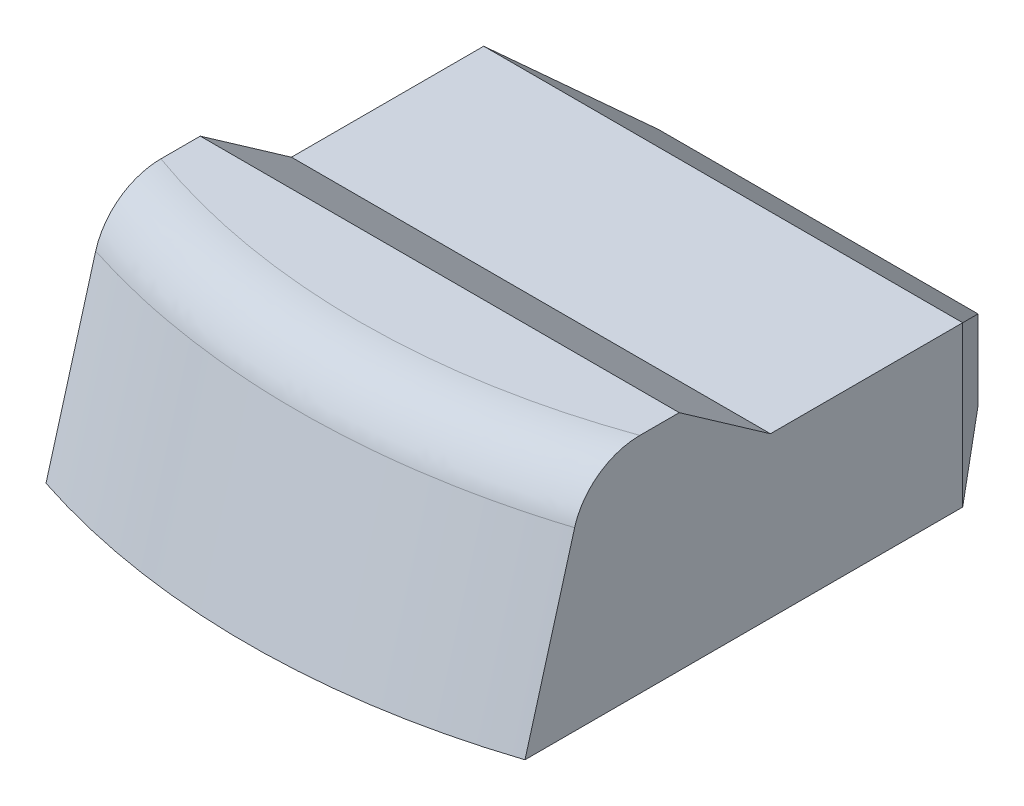
ISO-10303-21;
HEADER;
FILE_DESCRIPTION(('STEP AP214'),'2;1');
FILE_NAME('part.step','',(''),(''),'','','');
FILE_SCHEMA(('AUTOMOTIVE_DESIGN { 1 0 10303 214 1 1 1 1 }'));
ENDSEC;
DATA;
#1=APPLICATION_CONTEXT('core data for automotive mechanical design processes');
#2=APPLICATION_PROTOCOL_DEFINITION('international standard','automotive_design',2000,#1);
#3=PRODUCT_CONTEXT('',#1,'mechanical');
#4=PRODUCT('Part','Part','',(#3));
#5=PRODUCT_RELATED_PRODUCT_CATEGORY('part','',(#4));
#6=PRODUCT_DEFINITION_FORMATION('','',#4);
#7=PRODUCT_DEFINITION_CONTEXT('part definition',#1,'design');
#8=PRODUCT_DEFINITION('design','',#6,#7);
#9=PRODUCT_DEFINITION_SHAPE('','',#8);
#10=(LENGTH_UNIT() NAMED_UNIT(*) SI_UNIT(.MILLI.,.METRE.));
#11=(NAMED_UNIT(*) PLANE_ANGLE_UNIT() SI_UNIT($,.RADIAN.));
#12=(NAMED_UNIT(*) SI_UNIT($,.STERADIAN.) SOLID_ANGLE_UNIT());
#13=UNCERTAINTY_MEASURE_WITH_UNIT(LENGTH_MEASURE(1.E-05),#10,'distance_accuracy_value','');
#14=(GEOMETRIC_REPRESENTATION_CONTEXT(3) GLOBAL_UNCERTAINTY_ASSIGNED_CONTEXT((#13)) GLOBAL_UNIT_ASSIGNED_CONTEXT((#10,
#11,#12)) REPRESENTATION_CONTEXT('',''));
#15=CARTESIAN_POINT('',(0.,0.,0.));
#16=DIRECTION('',(0.,0.,1.));
#17=DIRECTION('',(1.,0.,0.));
#18=AXIS2_PLACEMENT_3D('',#15,#16,#17);
#19=CARTESIAN_POINT('',(-1.5,1.,-1.));
#20=DIRECTION('',(1.,0.,0.));
#21=DIRECTION('',(0.,0.,-1.));
#22=AXIS2_PLACEMENT_3D('',#19,#20,#21);
#23=PLANE('',#22);
#24=DIRECTION('',(0.,-0.962506842056082,0.271257403576802));
#25=VECTOR('',#24,1.);
#26=CARTESIAN_POINT('',(-1.5,3.27252326299068,1.41512388772601));
#27=LINE('',#26,#25);
#28=CARTESIAN_POINT('',(-1.5,1.10346466645646,2.02641637666557));
#29=VERTEX_POINT('',#28);
#30=CARTESIAN_POINT('',(-1.5,0.,2.33739905988714));
#31=VERTEX_POINT('',#30);
#32=EDGE_CURVE('E247',#29,#31,#27,.T.);
#33=ORIENTED_EDGE('',*,*,#32,.F.);
#34=CARTESIAN_POINT('',(2.70830684322417,1.4,0.953611082952631));
#35=CARTESIAN_POINT('',(2.90480216053723,1.4,1.2070748461588));
#36=CARTESIAN_POINT('',(2.9475211310453,1.08696180874379,1.26217901440734));
#37=CARTESIAN_POINT('',(2.61008316886546,1.4,1.02975696751454));
#38=CARTESIAN_POINT('',(2.79870225744536,1.4,1.28740898280391));
#39=CARTESIAN_POINT('',(2.84035223448131,1.08877224909897,1.34474891249301));
#40=CARTESIAN_POINT('',(2.50868658873575,1.4,1.10171193659962));
#41=CARTESIAN_POINT('',(2.68914337285149,1.4,1.36342095966334));
#42=CARTESIAN_POINT('',(2.7297682442871,1.09047379736045,1.42274151160097));
#43=CARTESIAN_POINT('',(2.3001965272481,1.4,1.23681623806267));
#44=CARTESIAN_POINT('',(2.46425624617787,1.4,1.50598264488656));
#45=CARTESIAN_POINT('',(2.5024783597193,1.09365451275781,1.56913199472107));
#46=CARTESIAN_POINT('',(2.19310340105303,1.4,1.29996611852508));
#47=CARTESIAN_POINT('',(2.34889459994895,1.4,1.57259661217946));
#48=CARTESIAN_POINT('',(2.3857728470109,1.09513369373568,1.63753047593341));
#49=CARTESIAN_POINT('',(1.86452979247221,1.4,1.47542772652407));
#50=CARTESIAN_POINT('',(1.99593113579299,1.4,1.7572302694531));
#51=CARTESIAN_POINT('',(2.02783842156122,1.09922741727615,1.82751790650991));
#52=CARTESIAN_POINT('',(1.6354860744495,1.4,1.57395948757977));
#53=CARTESIAN_POINT('',(1.74994366551745,1.4,1.86109428961873));
#54=CARTESIAN_POINT('',(1.77849811636481,1.10150305778773,1.93412435800199));
#55=CARTESIAN_POINT('',(1.16358453179024,1.4,1.73137493762001));
#56=CARTESIAN_POINT('',(1.24432808534851,1.4,2.02661859314906));
#57=CARTESIAN_POINT('',(1.26504682665347,1.10512179320635,2.10438022291786));
#58=CARTESIAN_POINT('',(0.920690377358358,1.4,1.79014861507342));
#59=CARTESIAN_POINT('',(0.984231794686004,1.4,2.08847146832563));
#60=CARTESIAN_POINT('',(1.0008970303385,1.10646230089659,2.16791044454911));
#61=CARTESIAN_POINT('',(0.428540676485296,1.4,1.86604720441325));
#62=CARTESIAN_POINT('',(0.458074944617396,1.4,2.16818279713448));
#63=CARTESIAN_POINT('',(0.465814989535816,1.10819097254949,2.24994290626126));
#64=CARTESIAN_POINT('',(0.179287451308821,1.4,1.88318710022988));
#65=CARTESIAN_POINT('',(0.191533513340432,1.4,2.18620661108285));
#66=CARTESIAN_POINT('',(0.194885220626692,1.10857947913625,2.26846134601073));
#67=CARTESIAN_POINT('',(-0.318225420387704,1.4,1.87535930565732));
#68=CARTESIAN_POINT('',(-0.34002467009437,1.4,2.17798853301576));
#69=CARTESIAN_POINT('',(-0.345908383384978,1.10840168141576,2.26000266903565));
#70=CARTESIAN_POINT('',(-0.566485945933431,1.4,1.85044739404374));
#71=CARTESIAN_POINT('',(-0.605540617450688,1.4,2.15178988477608));
#72=CARTESIAN_POINT('',(-0.615773155333674,1.10783664192084,2.23308581903983));
#73=CARTESIAN_POINT('',(-1.05537117106592,1.4,1.75933048043661));
#74=CARTESIAN_POINT('',(-1.12835646426599,1.4,2.05608037978549));
#75=CARTESIAN_POINT('',(-1.14735899250129,1.10575877633625,2.13459598282978));
#76=CARTESIAN_POINT('',(-1.29599314532529,1.4,1.69311091065949));
#77=CARTESIAN_POINT('',(-1.38612772301623,1.4,1.98637523895342));
#78=CARTESIAN_POINT('',(-1.40907715048945,1.10424561587624,2.06300724238052));
#79=CARTESIAN_POINT('',(-1.76271392712818,1.4,1.52114589109702));
#80=CARTESIAN_POINT('',(-1.88648853394616,1.4,1.80549329992791));
#81=CARTESIAN_POINT('',(-1.91698814578483,1.10028311052594,1.87698200377498));
#82=CARTESIAN_POINT('',(-1.9888180596227,1.4,1.41541503169728));
#83=CARTESIAN_POINT('',(-2.12949820743902,1.4,1.69399603129149));
#84=CARTESIAN_POINT('',(-2.1631866748736,1.09783411120657,1.76256132219892));
#85=CARTESIAN_POINT('',(-2.31208979213915,1.4,1.22957050942856));
#86=CARTESIAN_POINT('',(-2.47706490910219,1.4,1.49835820279965));
#87=CARTESIAN_POINT('',(-2.51543927575259,1.09348406922382,1.56128147865817));
#88=CARTESIAN_POINT('',(-2.41726698137184,1.4,1.16302538985214));
#89=CARTESIAN_POINT('',(-2.59048095920482,1.4,1.428125596636));
#90=CARTESIAN_POINT('',(-2.63008946035763,1.09191997931703,1.48918647466559));
#91=CARTESIAN_POINT('',(-2.62163688568641,1.4,1.02129246326764));
#92=CARTESIAN_POINT('',(-2.81118080158413,1.4,1.27848283761198));
#93=CARTESIAN_POINT('',(-2.8529536637098,1.08857126456154,1.33557125170229));
#94=CARTESIAN_POINT('',(-2.72082923322347,1.4,0.946104126279049));
#95=CARTESIAN_POINT('',(-2.91849489557526,1.4,1.19900560831358));
#96=CARTESIAN_POINT('',(-2.96116728716505,1.08678662618887,1.25405045476368));
#97=CARTESIAN_POINT('',(-2.81671017776694,1.4,0.866816583139384));
#98=CARTESIAN_POINT('',(-3.02220096830316,1.4,1.11530924639548));
#99=CARTESIAN_POINT('',(-3.06581344838483,1.08489427670771,1.16804825868122));
#100=(BOUNDED_SURFACE() B_SPLINE_SURFACE(3,2,((#34,#35,#36),(#37,#38,#39),(#40,#41,#42),(#43,
#44,#45),(#46,#47,#48),(#49,#50,#51),(#52,#53,#54),(#55,#56,#57),(#58,#59,#60),(#61,#62,#63),
(#64,#65,#66),(#67,#68,#69),(#70,#71,#72),(#73,#74,#75),(#76,#77,#78),(#79,#80,#81),(#82,#83,
#84),(#85,#86,#87),(#88,#89,#90),(#91,#92,#93),(#94,#95,#96),(#97,#98,#99)),.UNSPECIFIED.,.F.,
.F.,.F.) B_SPLINE_SURFACE_WITH_KNOTS((4,2,2,2,2,2,2,2,2,2,4),(3,3),(0.,0.372616706273002,
0.745210208159504,1.48938997276993,2.23562056799516,2.98158255622631,3.7265558554783,
4.47179202971756,5.21675328111897,5.58975114593426,5.96277189425997),(0.,1.),
.UNSPECIFIED.) GEOMETRIC_REPRESENTATION_ITEM() RATIONAL_B_SPLINE_SURFACE(((1.,0.780193732946976,
1.),(1.,0.781643997509428,1.),(1.,0.783003090076377,1.),(1.,0.785537880155209,1.),(1.,
0.786713589082591,1.),(1.,0.789961388737535,1.),(1.,0.791758077172778,1.),(1.,0.794609511843579,
1.),(1.,0.795662199769767,1.),(1.,0.797018930782984,1.),(1.,0.797323243209626,1.),(1.,
0.797183859747597,1.),(1.,0.79674115472551,1.),(1.,0.79510951215507,1.),(1.,0.793920311342515,
1.),(1.,0.790794746957907,1.),(1.,0.788858659181265,1.),(1.,0.785402060544927,1.),(1.,
0.78415672838802,1.),(1.,0.78148311196354,1.),(1.,0.780054816476498,1.),(1.,0.778535706236157,1.))) REPRESENTATION_ITEM('') SURFACE());
#101=CARTESIAN_POINT('',(-1.5,1.10346466645646,2.02641637666557));
#102=CARTESIAN_POINT('',(-1.5,1.12489309847498,2.02040114315995));
#103=CARTESIAN_POINT('',(-1.5,1.14576546997923,2.01248710571877));
#104=CARTESIAN_POINT('',(-1.5,1.18582273089755,1.99325865474593));
#105=CARTESIAN_POINT('',(-1.5,1.20501150655358,1.98195235353408));
#106=CARTESIAN_POINT('',(-1.5,1.24122372175092,1.9563109876655));
#107=CARTESIAN_POINT('',(-1.5,1.25824825232229,1.94197745885884));
#108=CARTESIAN_POINT('',(-1.5,1.28974607980548,1.91074007191704));
#109=CARTESIAN_POINT('',(-1.5,1.30421889063624,1.89383572520265));
#110=CARTESIAN_POINT('',(-1.5,1.33073695589082,1.857365304131));
#111=CARTESIAN_POINT('',(-1.5,1.3426870011588,1.83773010463919));
#112=CARTESIAN_POINT('',(-1.5,1.36331620142432,1.79679917837313));
#113=CARTESIAN_POINT('',(-1.5,1.37199307549377,1.77550230607917));
#114=CARTESIAN_POINT('',(-1.5,1.38595166146606,1.73173533999671));
#115=CARTESIAN_POINT('',(-1.5,1.39121978961525,1.7092609333953));
#116=CARTESIAN_POINT('',(-1.5,1.3982474768605,1.66379712744328));
#117=CARTESIAN_POINT('',(-1.5,1.40001126087978,1.64080838206522));
#118=CARTESIAN_POINT('',(-1.5,1.4,1.6178245301827));
#119=B_SPLINE_CURVE_WITH_KNOTS('',3,(#101,#102,#103,#104,#105,#106,#107,#108,#109,#110,#111,
#112,#113,#114,#115,#116,#117,#118),.UNSPECIFIED.,.F.,.F.,(4,2,2,2,2,2,2,2,4),(0.,
0.0666540198870982,0.13314989571827,0.199612115866452,0.266086982859454,0.334742518332056,
0.403445808813634,0.472421220738046,0.541313423630769),.UNSPECIFIED.);
#120=CARTESIAN_POINT('',(-1.5,1.4,1.6178245301827));
#121=VERTEX_POINT('',#120);
#122=EDGE_CURVE('E69',#29,#121,#119,.T.);
#123=ORIENTED_EDGE('',*,*,#122,.T.);
#124=DIRECTION('',(0.,0.,1.));
#125=VECTOR('',#124,1.);
#126=CARTESIAN_POINT('',(-1.5,1.4,-1.));
#127=LINE('',#126,#125);
#128=CARTESIAN_POINT('',(-1.5,1.4,1.37125920269685));
#129=VERTEX_POINT('',#128);
#130=EDGE_CURVE('E119',#129,#121,#127,.T.);
#131=ORIENTED_EDGE('',*,*,#130,.F.);
#132=DIRECTION('',(0.,0.573576436351047,0.819152044288991));
#133=VECTOR('',#132,1.);
#134=CARTESIAN_POINT('',(-1.5,2.,2.22814800674211));
#135=LINE('',#134,#133);
#136=CARTESIAN_POINT('',(-1.5,1.,0.8));
#137=VERTEX_POINT('',#136);
#138=EDGE_CURVE('E127',#129,#137,#135,.F.);
#139=ORIENTED_EDGE('',*,*,#138,.T.);
#140=DIRECTION('',(0.,0.,1.));
#141=VECTOR('',#140,1.);
#142=CARTESIAN_POINT('',(-1.5,1.,-1.));
#143=LINE('',#142,#141);
#144=CARTESIAN_POINT('',(-1.5,1.,-0.404123203702895));
#145=VERTEX_POINT('',#144);
#146=EDGE_CURVE('E259',#145,#137,#143,.T.);
#147=ORIENTED_EDGE('',*,*,#146,.F.);
#148=DIRECTION('',(0.,-1.,0.));
#149=VECTOR('',#148,1.);
#150=CARTESIAN_POINT('',(-1.5,1.,-0.404123203702895));
#151=LINE('',#150,#149);
#152=CARTESIAN_POINT('',(-1.5,0.,-0.404123203702895));
#153=VERTEX_POINT('',#152);
#154=EDGE_CURVE('E140',#145,#153,#151,.T.);
#155=ORIENTED_EDGE('',*,*,#154,.T.);
#156=DIRECTION('',(0.,0.,1.));
#157=VECTOR('',#156,1.);
#158=CARTESIAN_POINT('',(-1.5,0.,-1.));
#159=LINE('',#158,#157);
#160=EDGE_CURVE('E255',#153,#31,#159,.T.);
#161=ORIENTED_EDGE('',*,*,#160,.T.);
#162=EDGE_LOOP('',(#33,#123,#131,#139,#147,#155,#161));
#163=FACE_BOUND('',#162,.T.);
#164=ADVANCED_FACE('F41',(#163),#23,.F.);
#165=CARTESIAN_POINT('',(1.5,1.,-1.));
#166=DIRECTION('',(-1.,0.,0.));
#167=DIRECTION('',(0.,0.,1.));
#168=AXIS2_PLACEMENT_3D('',#165,#166,#167);
#169=PLANE('',#168);
#170=DIRECTION('',(0.,0.,-1.));
#171=VECTOR('',#170,1.);
#172=CARTESIAN_POINT('',(1.5,1.4,-1.));
#173=LINE('',#172,#171);
#174=CARTESIAN_POINT('',(1.5,1.4,1.61781942698476));
#175=VERTEX_POINT('',#174);
#176=CARTESIAN_POINT('',(1.5,1.4,1.37125920269685));
#177=VERTEX_POINT('',#176);
#178=EDGE_CURVE('E113',#175,#177,#173,.T.);
#179=ORIENTED_EDGE('',*,*,#178,.F.);
#180=CARTESIAN_POINT('',(1.5,1.4,1.61781942698476));
#181=CARTESIAN_POINT('',(1.5,1.40001400048678,1.64270173969308));
#182=CARTESIAN_POINT('',(1.5,1.39794453115127,1.66759118646502));
#183=CARTESIAN_POINT('',(1.5,1.38970733854994,1.71671888814256));
#184=CARTESIAN_POINT('',(1.5,1.38353360018723,1.74095613287355));
#185=CARTESIAN_POINT('',(1.5,1.36714702602916,1.78806526323608));
#186=CARTESIAN_POINT('',(1.5,1.35692930659402,1.81093545939677));
#187=CARTESIAN_POINT('',(1.5,1.33267139299707,1.85453649897296));
#188=CARTESIAN_POINT('',(1.5,1.31863413999674,1.87526897163375));
#189=CARTESIAN_POINT('',(1.5,1.28761462183012,1.91321970141492));
#190=CARTESIAN_POINT('',(1.5,1.27075042565568,1.93053439331559));
#191=CARTESIAN_POINT('',(1.5,1.23420931957924,1.96188200429646));
#192=CARTESIAN_POINT('',(1.5,1.2145346548272,1.97591751959066));
#193=CARTESIAN_POINT('',(1.5,1.17958853694658,1.9963009940046));
#194=CARTESIAN_POINT('',(1.5,1.1649059744988,2.00367434012915));
#195=CARTESIAN_POINT('',(1.5,1.13473662931244,2.0165074997071));
#196=CARTESIAN_POINT('',(1.5,1.11925025526362,2.02196827485417));
#197=CARTESIAN_POINT('',(1.5,1.10346456831409,2.02641175759383));
#198=B_SPLINE_CURVE_WITH_KNOTS('',3,(#180,#181,#182,#183,#184,#185,#186,#187,#188,#189,#190,
#191,#192,#193,#194,#195,#196,#197),.UNSPECIFIED.,.F.,.F.,(4,2,2,2,2,2,2,2,4),(0.,
0.0745733532734561,0.149256240728793,0.224029594153818,0.298745531886072,0.370888386494628,
0.442973928592221,0.492140436058669,0.541282185629666),.UNSPECIFIED.);
#199=CARTESIAN_POINT('',(1.5,1.10346456831409,2.02641175759383));
#200=VERTEX_POINT('',#199);
#201=EDGE_CURVE('E11',#175,#200,#198,.T.);
#202=ORIENTED_EDGE('',*,*,#201,.T.);
#203=DIRECTION('',(0.,-0.962506842056082,0.271257403576802));
#204=VECTOR('',#203,1.);
#205=CARTESIAN_POINT('',(1.5,3.27252326299068,1.41511924099541));
#206=LINE('',#205,#204);
#207=CARTESIAN_POINT('',(1.5,0.,2.33739441315654));
#208=VERTEX_POINT('',#207);
#209=EDGE_CURVE('E276',#208,#200,#206,.F.);
#210=ORIENTED_EDGE('',*,*,#209,.F.);
#211=DIRECTION('',(0.,0.,-1.));
#212=VECTOR('',#211,1.);
#213=CARTESIAN_POINT('',(1.5,0.,-1.));
#214=LINE('',#213,#212);
#215=CARTESIAN_POINT('',(1.5,0.,-0.404123203702895));
#216=VERTEX_POINT('',#215);
#217=EDGE_CURVE('E253',#208,#216,#214,.T.);
#218=ORIENTED_EDGE('',*,*,#217,.T.);
#219=DIRECTION('',(0.,1.,0.));
#220=VECTOR('',#219,1.);
#221=CARTESIAN_POINT('',(1.5,1.,-0.404123203702895));
#222=LINE('',#221,#220);
#223=CARTESIAN_POINT('',(1.5,1.,-0.404123203702895));
#224=VERTEX_POINT('',#223);
#225=EDGE_CURVE('E234',#216,#224,#222,.T.);
#226=ORIENTED_EDGE('',*,*,#225,.T.);
#227=DIRECTION('',(0.,0.,-1.));
#228=VECTOR('',#227,1.);
#229=CARTESIAN_POINT('',(1.5,1.,-1.));
#230=LINE('',#229,#228);
#231=CARTESIAN_POINT('',(1.5,1.,0.799999999999999));
#232=VERTEX_POINT('',#231);
#233=EDGE_CURVE('E131',#232,#224,#230,.T.);
#234=ORIENTED_EDGE('',*,*,#233,.F.);
#235=DIRECTION('',(0.,-0.573576436351047,-0.819152044288991));
#236=VECTOR('',#235,1.);
#237=CARTESIAN_POINT('',(1.5,2.,2.22814800674211));
#238=LINE('',#237,#236);
#239=EDGE_CURVE('E130',#232,#177,#238,.F.);
#240=ORIENTED_EDGE('',*,*,#239,.T.);
#241=EDGE_LOOP('',(#179,#202,#210,#218,#226,#234,#240));
#242=FACE_BOUND('',#241,.T.);
#243=ADVANCED_FACE('F135',(#242),#169,.F.);
#244=CARTESIAN_POINT('',(0.,2.,2.22814800674211));
#245=DIRECTION('',(0.,-0.819152044288991,0.573576436351047));
#246=DIRECTION('',(-1.,0.,0.));
#247=AXIS2_PLACEMENT_3D('',#244,#245,#246);
#248=PLANE('',#247);
#249=ORIENTED_EDGE('',*,*,#138,.F.);
#250=DIRECTION('',(-1.,0.,0.));
#251=VECTOR('',#250,1.);
#252=CARTESIAN_POINT('',(0.,1.4,1.37125920269685));
#253=LINE('',#252,#251);
#254=EDGE_CURVE('E116',#129,#177,#253,.F.);
#255=ORIENTED_EDGE('',*,*,#254,.T.);
#256=ORIENTED_EDGE('',*,*,#239,.F.);
#257=DIRECTION('',(-1.,0.,0.));
#258=VECTOR('',#257,1.);
#259=CARTESIAN_POINT('',(-1.5,1.,0.8));
#260=LINE('',#259,#258);
#261=EDGE_CURVE('E248',#232,#137,#260,.T.);
#262=ORIENTED_EDGE('',*,*,#261,.T.);
#263=EDGE_LOOP('',(#249,#255,#256,#262));
#264=FACE_BOUND('',#263,.T.);
#265=ADVANCED_FACE('F123',(#264),#248,.F.);
#266=CARTESIAN_POINT('',(-7.08002108279338E-06,3.27252326299068,-3.15584780331114));
#267=DIRECTION('',(0.,-1.,0.));
#268=DIRECTION('',(0.,0.,-1.));
#269=AXIS2_PLACEMENT_3D('',#266,#267,#268);
#270=CIRCLE('',#269,4.81079629170161);
#271=DIRECTION('',(0.,-0.962506842056082,0.271257403576802));
#272=VECTOR('',#271,1.);
#273=SURFACE_OF_LINEAR_EXTRUSION('',#270,#272);
#274=ORIENTED_EDGE('',*,*,#209,.T.);
#275=CARTESIAN_POINT('',(2.9475211310453,1.08696180874379,1.26217901440734));
#276=CARTESIAN_POINT('',(2.84035223448131,1.08877224909897,1.34474891249301));
#277=CARTESIAN_POINT('',(2.7297682442871,1.09047379736045,1.42274151160097));
#278=CARTESIAN_POINT('',(2.5024783597193,1.09365451275781,1.56913199472107));
#279=CARTESIAN_POINT('',(2.3857728470109,1.09513369373568,1.63753047593341));
#280=CARTESIAN_POINT('',(2.02783842156122,1.09922741727615,1.82751790650991));
#281=CARTESIAN_POINT('',(1.77849811636481,1.10150305778773,1.93412435800199));
#282=CARTESIAN_POINT('',(1.26504682665347,1.10512179320635,2.10438022291786));
#283=CARTESIAN_POINT('',(1.0008970303385,1.10646230089659,2.16791044454911));
#284=CARTESIAN_POINT('',(0.465814989535816,1.10819097254949,2.24994290626126));
#285=CARTESIAN_POINT('',(0.194885220626692,1.10857947913625,2.26846134601073));
#286=CARTESIAN_POINT('',(-0.345908383384978,1.10840168141576,2.26000266903565));
#287=CARTESIAN_POINT('',(-0.615773155333674,1.10783664192084,2.23308581903983));
#288=CARTESIAN_POINT('',(-1.14735899250129,1.10575877633625,2.13459598282978));
#289=CARTESIAN_POINT('',(-1.40907715048945,1.10424561587624,2.06300724238052));
#290=CARTESIAN_POINT('',(-1.91698814578483,1.10028311052594,1.87698200377498));
#291=CARTESIAN_POINT('',(-2.1631866748736,1.09783411120657,1.76256132219892));
#292=CARTESIAN_POINT('',(-2.51543927575259,1.09348406922382,1.56128147865817));
#293=CARTESIAN_POINT('',(-2.63008946035763,1.09191997931703,1.48918647466559));
#294=CARTESIAN_POINT('',(-2.8529536637098,1.08857126456154,1.33557125170229));
#295=CARTESIAN_POINT('',(-2.96116728716505,1.08678662618887,1.25405045476368));
#296=CARTESIAN_POINT('',(-3.06581344838483,1.08489427670771,1.16804825868122));
#297=B_SPLINE_CURVE_WITH_KNOTS('',3,(#275,#276,#277,#278,#279,#280,#281,#282,#283,#284,#285,
#286,#287,#288,#289,#290,#291,#292,#293,#294,#295,#296),.UNSPECIFIED.,.F.,.F.,(4,2,2,2,2,2,2,2,
2,2,4),(0.,0.372616706273002,0.745210208159504,1.48938997276993,2.23562056799516,
2.98158255622631,3.7265558554783,4.47179202971756,5.21675328111897,5.58975114593426,
5.96277189425997),.UNSPECIFIED.);
#298=EDGE_CURVE('E133',#200,#29,#297,.T.);
#299=ORIENTED_EDGE('',*,*,#298,.T.);
#300=ORIENTED_EDGE('',*,*,#32,.T.);
#301=CARTESIAN_POINT('',(-7.08002108279338E-06,0.,-2.23357263115002));
#302=DIRECTION('',(0.,-1.,0.));
#303=DIRECTION('',(0.,0.,-1.));
#304=AXIS2_PLACEMENT_3D('',#301,#302,#303);
#305=CIRCLE('',#304,4.81079629170161);
#306=EDGE_CURVE('E128',#208,#31,#305,.T.);
#307=ORIENTED_EDGE('',*,*,#306,.F.);
#308=EDGE_LOOP('',(#274,#299,#300,#307));
#309=FACE_BOUND('',#308,.T.);
#310=ADVANCED_FACE('F158',(#309),#273,.T.);
#311=CARTESIAN_POINT('',(0.,0.,0.));
#312=DIRECTION('',(0.,1.,0.));
#313=DIRECTION('',(0.,0.,1.));
#314=AXIS2_PLACEMENT_3D('',#311,#312,#313);
#315=PLANE('',#314);
#316=ORIENTED_EDGE('',*,*,#217,.F.);
#317=ORIENTED_EDGE('',*,*,#306,.T.);
#318=ORIENTED_EDGE('',*,*,#160,.F.);
#319=DIRECTION('',(-0.642787609686541,0.,0.766044443118977));
#320=VECTOR('',#319,1.);
#321=CARTESIAN_POINT('',(-1.5,0.,-0.404123203702895));
#322=LINE('',#321,#320);
#323=CARTESIAN_POINT('',(-0.999999999999998,0.,-1.));
#324=VERTEX_POINT('',#323);
#325=EDGE_CURVE('E224',#153,#324,#322,.F.);
#326=ORIENTED_EDGE('',*,*,#325,.T.);
#327=DIRECTION('',(-1.,0.,0.));
#328=VECTOR('',#327,1.);
#329=CARTESIAN_POINT('',(-1.5,0.,-1.));
#330=LINE('',#329,#328);
#331=CARTESIAN_POINT('',(0.999999999999998,0.,-1.));
#332=VERTEX_POINT('',#331);
#333=EDGE_CURVE('E264',#332,#324,#330,.T.);
#334=ORIENTED_EDGE('',*,*,#333,.F.);
#335=DIRECTION('',(-0.642787609686541,0.,-0.766044443118977));
#336=VECTOR('',#335,1.);
#337=CARTESIAN_POINT('',(0.999999999999998,0.,-1.));
#338=LINE('',#337,#336);
#339=EDGE_CURVE('E229',#332,#216,#338,.F.);
#340=ORIENTED_EDGE('',*,*,#339,.T.);
#341=EDGE_LOOP('',(#316,#317,#318,#326,#334,#340));
#342=FACE_BOUND('',#341,.T.);
#343=ADVANCED_FACE('F275',(#342),#315,.F.);
#344=CARTESIAN_POINT('',(-1.5,1.,-1.));
#345=DIRECTION('',(0.,0.,1.));
#346=DIRECTION('',(1.,0.,0.));
#347=AXIS2_PLACEMENT_3D('',#344,#345,#346);
#348=PLANE('',#347);
#349=DIRECTION('',(1.,0.,0.));
#350=VECTOR('',#349,1.);
#351=CARTESIAN_POINT('',(1.5,0.499999999999998,-1.));
#352=LINE('',#351,#350);
#353=CARTESIAN_POINT('',(-0.999999999999998,0.499999999999998,-1.));
#354=VERTEX_POINT('',#353);
#355=CARTESIAN_POINT('',(0.999999999999998,0.499999999999998,-1.));
#356=VERTEX_POINT('',#355);
#357=EDGE_CURVE('E240',#354,#356,#352,.T.);
#358=ORIENTED_EDGE('',*,*,#357,.T.);
#359=DIRECTION('',(0.,-1.,0.));
#360=VECTOR('',#359,1.);
#361=CARTESIAN_POINT('',(0.999999999999998,1.,-1.));
#362=LINE('',#361,#360);
#363=EDGE_CURVE('E233',#356,#332,#362,.T.);
#364=ORIENTED_EDGE('',*,*,#363,.T.);
#365=ORIENTED_EDGE('',*,*,#333,.T.);
#366=DIRECTION('',(0.,1.,0.));
#367=VECTOR('',#366,1.);
#368=CARTESIAN_POINT('',(-0.999999999999998,1.,-1.));
#369=LINE('',#368,#367);
#370=EDGE_CURVE('E221',#324,#354,#369,.T.);
#371=ORIENTED_EDGE('',*,*,#370,.T.);
#372=EDGE_LOOP('',(#358,#364,#365,#371));
#373=FACE_BOUND('',#372,.T.);
#374=ADVANCED_FACE('F188',(#373),#348,.F.);
#375=CARTESIAN_POINT('',(0.,1.,0.));
#376=DIRECTION('',(0.,1.,0.));
#377=DIRECTION('',(0.,0.,1.));
#378=AXIS2_PLACEMENT_3D('',#375,#376,#377);
#379=PLANE('',#378);
#380=ORIENTED_EDGE('',*,*,#233,.T.);
#381=DIRECTION('',(-1.,0.,0.));
#382=VECTOR('',#381,1.);
#383=CARTESIAN_POINT('',(-1.5,1.,-0.404123203702895));
#384=LINE('',#383,#382);
#385=EDGE_CURVE('E245',#224,#145,#384,.T.);
#386=ORIENTED_EDGE('',*,*,#385,.T.);
#387=ORIENTED_EDGE('',*,*,#146,.T.);
#388=ORIENTED_EDGE('',*,*,#261,.F.);
#389=EDGE_LOOP('',(#380,#386,#387,#388));
#390=FACE_BOUND('',#389,.T.);
#391=ADVANCED_FACE('F215',(#390),#379,.T.);
#392=CARTESIAN_POINT('',(-1.5,1.,-0.404123203702895));
#393=DIRECTION('',(0.766044443118977,0.,0.642787609686541));
#394=DIRECTION('',(0.,-1.,0.));
#395=AXIS2_PLACEMENT_3D('',#392,#393,#394);
#396=PLANE('',#395);
#397=ORIENTED_EDGE('',*,*,#325,.F.);
#398=ORIENTED_EDGE('',*,*,#154,.F.);
#399=DIRECTION('',(-0.540716203060938,0.540716203060938,0.64440047757177));
#400=VECTOR('',#399,1.);
#401=CARTESIAN_POINT('',(-1.5,1.,-0.404123203702895));
#402=LINE('',#401,#400);
#403=EDGE_CURVE('E250',#354,#145,#402,.T.);
#404=ORIENTED_EDGE('',*,*,#403,.F.);
#405=ORIENTED_EDGE('',*,*,#370,.F.);
#406=EDGE_LOOP('',(#397,#398,#404,#405));
#407=FACE_BOUND('',#406,.T.);
#408=ADVANCED_FACE('F210',(#407),#396,.F.);
#409=CARTESIAN_POINT('',(0.,1.,-0.404123203702895));
#410=DIRECTION('',(0.,0.766044443118977,-0.642787609686541));
#411=DIRECTION('',(1.,0.,0.));
#412=AXIS2_PLACEMENT_3D('',#409,#410,#411);
#413=PLANE('',#412);
#414=ORIENTED_EDGE('',*,*,#403,.T.);
#415=ORIENTED_EDGE('',*,*,#385,.F.);
#416=DIRECTION('',(0.540716203060938,0.540716203060938,0.64440047757177));
#417=VECTOR('',#416,1.);
#418=CARTESIAN_POINT('',(1.06143898162104,0.561438981621044,-0.926779872927789));
#419=LINE('',#418,#417);
#420=EDGE_CURVE('E244',#356,#224,#419,.T.);
#421=ORIENTED_EDGE('',*,*,#420,.F.);
#422=ORIENTED_EDGE('',*,*,#357,.F.);
#423=EDGE_LOOP('',(#414,#415,#421,#422));
#424=FACE_BOUND('',#423,.T.);
#425=ADVANCED_FACE('F203',(#424),#413,.T.);
#426=CARTESIAN_POINT('',(0.999999999999998,1.,-1.));
#427=DIRECTION('',(-0.766044443118977,0.,0.642787609686541));
#428=DIRECTION('',(0.,-1.,0.));
#429=AXIS2_PLACEMENT_3D('',#426,#427,#428);
#430=PLANE('',#429);
#431=ORIENTED_EDGE('',*,*,#420,.T.);
#432=ORIENTED_EDGE('',*,*,#225,.F.);
#433=ORIENTED_EDGE('',*,*,#339,.F.);
#434=ORIENTED_EDGE('',*,*,#363,.F.);
#435=EDGE_LOOP('',(#431,#432,#433,#434));
#436=FACE_BOUND('',#435,.T.);
#437=ADVANCED_FACE('F176',(#436),#430,.F.);
#438=CARTESIAN_POINT('',(0.,1.4,0.));
#439=DIRECTION('',(0.,1.,0.));
#440=DIRECTION('',(0.,0.,1.));
#441=AXIS2_PLACEMENT_3D('',#438,#439,#440);
#442=PLANE('',#441);
#443=ORIENTED_EDGE('',*,*,#130,.T.);
#444=CARTESIAN_POINT('',(-2.81671017776694,1.4,0.866816583139384));
#445=CARTESIAN_POINT('',(-2.72082923322347,1.4,0.946104126279049));
#446=CARTESIAN_POINT('',(-2.62163688568641,1.4,1.02129246326764));
#447=CARTESIAN_POINT('',(-2.41726698137184,1.4,1.16302538985214));
#448=CARTESIAN_POINT('',(-2.31208979213915,1.4,1.22957050942856));
#449=CARTESIAN_POINT('',(-1.9888180596227,1.4,1.41541503169728));
#450=CARTESIAN_POINT('',(-1.76271392712818,1.4,1.52114589109702));
#451=CARTESIAN_POINT('',(-1.29599314532529,1.4,1.69311091065949));
#452=CARTESIAN_POINT('',(-1.05537117106592,1.4,1.75933048043661));
#453=CARTESIAN_POINT('',(-0.566485945933431,1.4,1.85044739404374));
#454=CARTESIAN_POINT('',(-0.318225420387704,1.4,1.87535930565732));
#455=CARTESIAN_POINT('',(0.179287451308821,1.4,1.88318710022988));
#456=CARTESIAN_POINT('',(0.428540676485296,1.4,1.86604720441325));
#457=CARTESIAN_POINT('',(0.920690377358358,1.4,1.79014861507342));
#458=CARTESIAN_POINT('',(1.16358453179024,1.4,1.73137493762001));
#459=CARTESIAN_POINT('',(1.6354860744495,1.4,1.57395948757977));
#460=CARTESIAN_POINT('',(1.86452979247221,1.4,1.47542772652407));
#461=CARTESIAN_POINT('',(2.19310340105303,1.4,1.29996611852508));
#462=CARTESIAN_POINT('',(2.3001965272481,1.4,1.23681623806267));
#463=CARTESIAN_POINT('',(2.50868658873575,1.4,1.10171193659962));
#464=CARTESIAN_POINT('',(2.61008316886546,1.4,1.02975696751454));
#465=CARTESIAN_POINT('',(2.70830684322417,1.4,0.953611082952631));
#466=B_SPLINE_CURVE_WITH_KNOTS('',3,(#444,#445,#446,#447,#448,#449,#450,#451,#452,#453,#454,
#455,#456,#457,#458,#459,#460,#461,#462,#463,#464,#465),.UNSPECIFIED.,.F.,.F.,(4,2,2,2,2,2,2,2,
2,2,4),(0.,0.373020748325707,0.746018613140999,1.49097986454241,2.23621603878167,
2.98118933803366,3.72715132626481,4.47338192149004,5.21756168610046,5.59015518798696,
5.96277189425997),.UNSPECIFIED.);
#467=EDGE_CURVE('E53',#121,#175,#466,.T.);
#468=ORIENTED_EDGE('',*,*,#467,.T.);
#469=ORIENTED_EDGE('',*,*,#178,.T.);
#470=ORIENTED_EDGE('',*,*,#254,.F.);
#471=EDGE_LOOP('',(#443,#468,#469,#470));
#472=FACE_BOUND('',#471,.T.);
#473=ADVANCED_FACE('F114',(#472),#442,.T.);
#474=ORIENTED_EDGE('',*,*,#201,.F.);
#475=ORIENTED_EDGE('',*,*,#467,.F.);
#476=ORIENTED_EDGE('',*,*,#122,.F.);
#477=ORIENTED_EDGE('',*,*,#298,.F.);
#478=EDGE_LOOP('',(#474,#475,#476,#477));
#479=FACE_BOUND('',#478,.T.);
#480=ADVANCED_FACE('F170',(#479),#100,.T.);
#481=CLOSED_SHELL('',(#164,#243,#265,#310,#343,#374,#391,#408,#425,#437,#473,#480));
#482=MANIFOLD_SOLID_BREP('B2',#481);
#483=ADVANCED_BREP_SHAPE_REPRESENTATION('',(#18,#482),#14);
#484=SHAPE_DEFINITION_REPRESENTATION(#9,#483);
ENDSEC;
END-ISO-10303-21;
